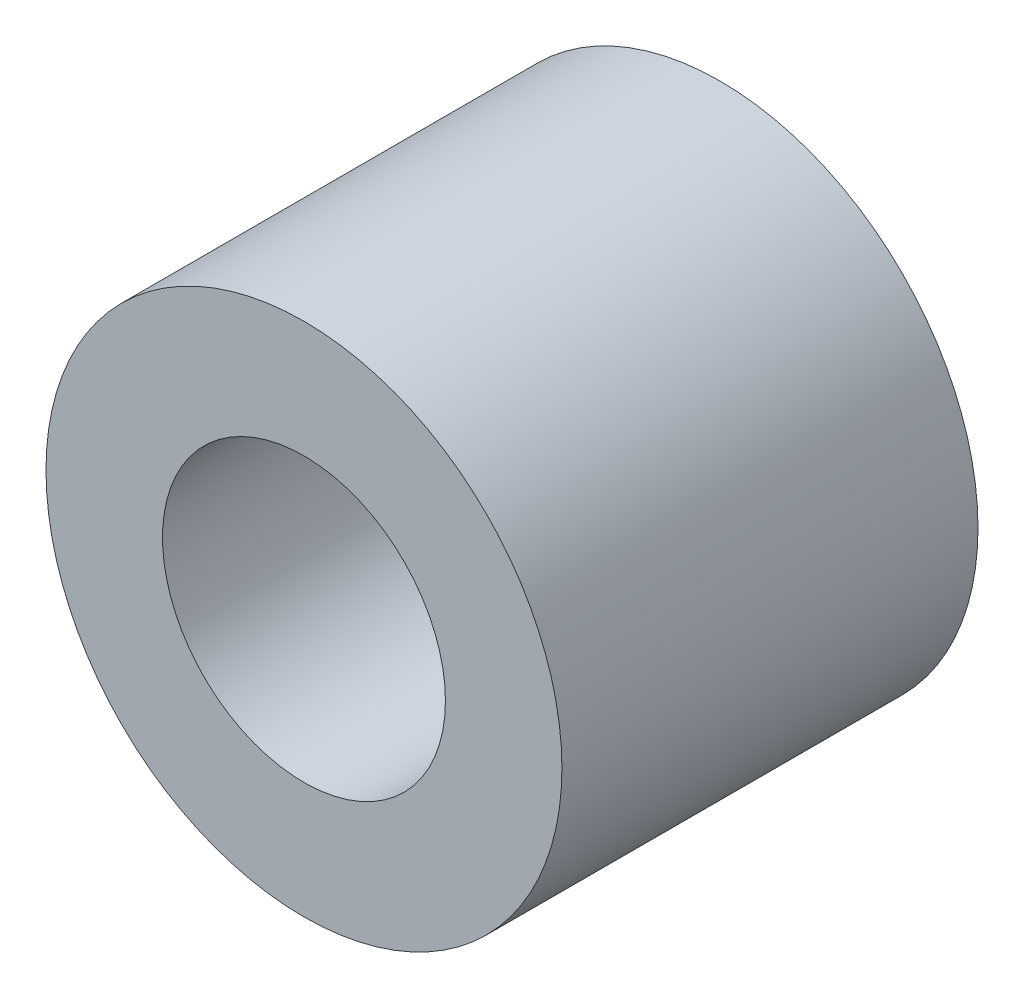
ISO-10303-21;
HEADER;
FILE_DESCRIPTION(('STEP AP214'),'2;1');
FILE_NAME('part.step','',(''),(''),'','','');
FILE_SCHEMA(('AUTOMOTIVE_DESIGN { 1 0 10303 214 1 1 1 1 }'));
ENDSEC;
DATA;
#1=APPLICATION_CONTEXT('core data for automotive mechanical design processes');
#2=APPLICATION_PROTOCOL_DEFINITION('international standard','automotive_design',2000,#1);
#3=PRODUCT_CONTEXT('',#1,'mechanical');
#4=PRODUCT('Part','Part','',(#3));
#5=PRODUCT_RELATED_PRODUCT_CATEGORY('part','',(#4));
#6=PRODUCT_DEFINITION_FORMATION('','',#4);
#7=PRODUCT_DEFINITION_CONTEXT('part definition',#1,'design');
#8=PRODUCT_DEFINITION('design','',#6,#7);
#9=PRODUCT_DEFINITION_SHAPE('','',#8);
#10=(LENGTH_UNIT() NAMED_UNIT(*) SI_UNIT(.MILLI.,.METRE.));
#11=(NAMED_UNIT(*) PLANE_ANGLE_UNIT() SI_UNIT($,.RADIAN.));
#12=(NAMED_UNIT(*) SI_UNIT($,.STERADIAN.) SOLID_ANGLE_UNIT());
#13=UNCERTAINTY_MEASURE_WITH_UNIT(LENGTH_MEASURE(1.E-05),#10,'distance_accuracy_value','');
#14=(GEOMETRIC_REPRESENTATION_CONTEXT(3) GLOBAL_UNCERTAINTY_ASSIGNED_CONTEXT((#13)) GLOBAL_UNIT_ASSIGNED_CONTEXT((#10,
#11,#12)) REPRESENTATION_CONTEXT('',''));
#15=CARTESIAN_POINT('',(0.,0.,0.));
#16=DIRECTION('',(0.,0.,1.));
#17=DIRECTION('',(1.,0.,0.));
#18=AXIS2_PLACEMENT_3D('',#15,#16,#17);
#19=CARTESIAN_POINT('',(0.,0.,5.));
#20=DIRECTION('',(0.,0.,1.));
#21=DIRECTION('',(1.,0.,0.));
#22=AXIS2_PLACEMENT_3D('',#19,#20,#21);
#23=PLANE('',#22);
#24=CARTESIAN_POINT('',(0.,0.,5.));
#25=DIRECTION('',(0.,0.,1.));
#26=DIRECTION('',(1.,0.,0.));
#27=AXIS2_PLACEMENT_3D('',#24,#25,#26);
#28=CIRCLE('',#27,3.1);
#29=CARTESIAN_POINT('',(3.1,0.,5.));
#30=VERTEX_POINT('',#29);
#31=EDGE_CURVE('E10',#30,#30,#28,.T.);
#32=ORIENTED_EDGE('',*,*,#31,.T.);
#33=EDGE_LOOP('',(#32));
#34=FACE_BOUND('',#33,.T.);
#35=CARTESIAN_POINT('',(0.,0.,5.));
#36=DIRECTION('',(0.,0.,1.));
#37=DIRECTION('',(1.,0.,0.));
#38=AXIS2_PLACEMENT_3D('',#35,#36,#37);
#39=CIRCLE('',#38,1.7);
#40=CARTESIAN_POINT('',(1.7,0.,5.));
#41=VERTEX_POINT('',#40);
#42=EDGE_CURVE('E42',#41,#41,#39,.T.);
#43=ORIENTED_EDGE('',*,*,#42,.F.);
#44=EDGE_LOOP('',(#43));
#45=FACE_BOUND('',#44,.T.);
#46=ADVANCED_FACE('F31',(#34,#45),#23,.T.);
#47=CARTESIAN_POINT('',(0.,0.,0.));
#48=DIRECTION('',(0.,0.,1.));
#49=DIRECTION('',(1.,0.,0.));
#50=AXIS2_PLACEMENT_3D('',#47,#48,#49);
#51=PLANE('',#50);
#52=CARTESIAN_POINT('',(0.,0.,0.));
#53=DIRECTION('',(0.,0.,1.));
#54=DIRECTION('',(1.,0.,0.));
#55=AXIS2_PLACEMENT_3D('',#52,#53,#54);
#56=CIRCLE('',#55,3.1);
#57=CARTESIAN_POINT('',(3.1,0.,0.));
#58=VERTEX_POINT('',#57);
#59=EDGE_CURVE('E35',#58,#58,#56,.T.);
#60=ORIENTED_EDGE('',*,*,#59,.F.);
#61=EDGE_LOOP('',(#60));
#62=FACE_BOUND('',#61,.T.);
#63=CARTESIAN_POINT('',(0.,0.,0.));
#64=DIRECTION('',(0.,0.,1.));
#65=DIRECTION('',(1.,0.,0.));
#66=AXIS2_PLACEMENT_3D('',#63,#64,#65);
#67=CIRCLE('',#66,1.7);
#68=CARTESIAN_POINT('',(1.7,0.,0.));
#69=VERTEX_POINT('',#68);
#70=EDGE_CURVE('E44',#69,#69,#67,.T.);
#71=ORIENTED_EDGE('',*,*,#70,.T.);
#72=EDGE_LOOP('',(#71));
#73=FACE_BOUND('',#72,.T.);
#74=ADVANCED_FACE('F54',(#62,#73),#51,.F.);
#75=CARTESIAN_POINT('',(0.,0.,5.));
#76=DIRECTION('',(0.,0.,-1.));
#77=DIRECTION('',(-1.,0.,0.));
#78=AXIS2_PLACEMENT_3D('',#75,#76,#77);
#79=CYLINDRICAL_SURFACE('',#78,3.1);
#80=ORIENTED_EDGE('',*,*,#31,.F.);
#81=EDGE_LOOP('',(#80));
#82=FACE_BOUND('',#81,.T.);
#83=ORIENTED_EDGE('',*,*,#59,.T.);
#84=EDGE_LOOP('',(#83));
#85=FACE_BOUND('',#84,.T.);
#86=ADVANCED_FACE('F33',(#82,#85),#79,.T.);
#87=CARTESIAN_POINT('',(0.,0.,5.));
#88=DIRECTION('',(0.,0.,-1.));
#89=DIRECTION('',(-1.,0.,0.));
#90=AXIS2_PLACEMENT_3D('',#87,#88,#89);
#91=CYLINDRICAL_SURFACE('',#90,1.7);
#92=ORIENTED_EDGE('',*,*,#42,.T.);
#93=EDGE_LOOP('',(#92));
#94=FACE_BOUND('',#93,.T.);
#95=ORIENTED_EDGE('',*,*,#70,.F.);
#96=EDGE_LOOP('',(#95));
#97=FACE_BOUND('',#96,.T.);
#98=ADVANCED_FACE('F50',(#94,#97),#91,.F.);
#99=CLOSED_SHELL('',(#46,#74,#86,#98));
#100=MANIFOLD_SOLID_BREP('B2',#99);
#101=ADVANCED_BREP_SHAPE_REPRESENTATION('',(#18,#100),#14);
#102=SHAPE_DEFINITION_REPRESENTATION(#9,#101);
ENDSEC;
END-ISO-10303-21;
